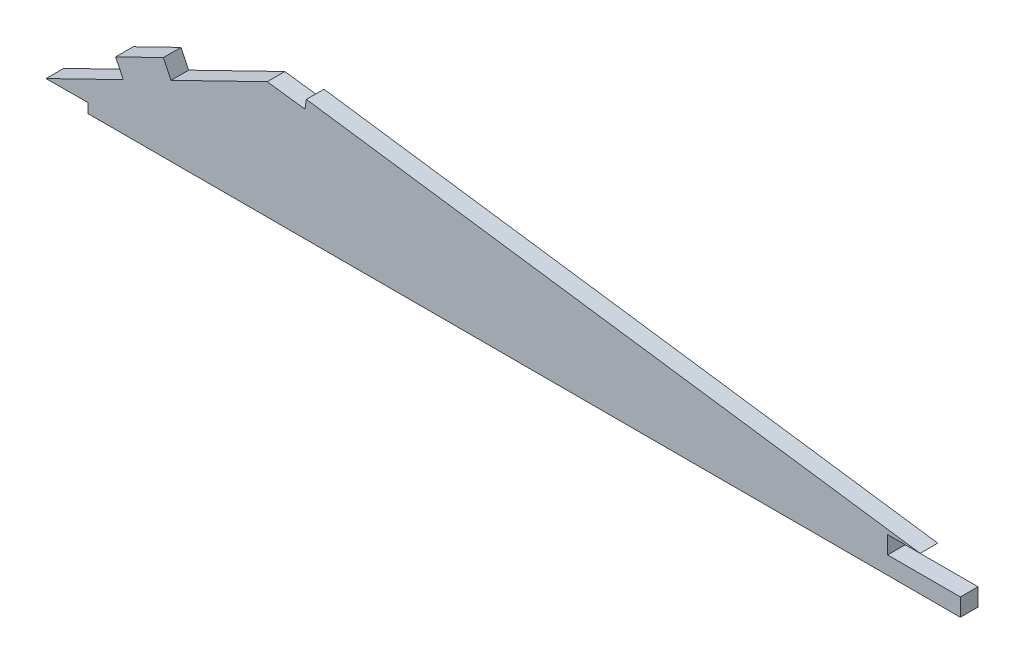
ISO-10303-21;
HEADER;
FILE_DESCRIPTION(('STEP AP214'),'2;1');
FILE_NAME('part.step','',(''),(''),'','','');
FILE_SCHEMA(('AUTOMOTIVE_DESIGN { 1 0 10303 214 1 1 1 1 }'));
ENDSEC;
DATA;
#1=APPLICATION_CONTEXT('core data for automotive mechanical design processes');
#2=APPLICATION_PROTOCOL_DEFINITION('international standard','automotive_design',2000,#1);
#3=PRODUCT_CONTEXT('',#1,'mechanical');
#4=PRODUCT('Part','Part','',(#3));
#5=PRODUCT_RELATED_PRODUCT_CATEGORY('part','',(#4));
#6=PRODUCT_DEFINITION_FORMATION('','',#4);
#7=PRODUCT_DEFINITION_CONTEXT('part definition',#1,'design');
#8=PRODUCT_DEFINITION('design','',#6,#7);
#9=PRODUCT_DEFINITION_SHAPE('','',#8);
#10=(LENGTH_UNIT() NAMED_UNIT(*) SI_UNIT(.MILLI.,.METRE.));
#11=(NAMED_UNIT(*) PLANE_ANGLE_UNIT() SI_UNIT($,.RADIAN.));
#12=(NAMED_UNIT(*) SI_UNIT($,.STERADIAN.) SOLID_ANGLE_UNIT());
#13=UNCERTAINTY_MEASURE_WITH_UNIT(LENGTH_MEASURE(1.E-05),#10,'distance_accuracy_value','');
#14=(GEOMETRIC_REPRESENTATION_CONTEXT(3) GLOBAL_UNCERTAINTY_ASSIGNED_CONTEXT((#13)) GLOBAL_UNIT_ASSIGNED_CONTEXT((#10,
#11,#12)) REPRESENTATION_CONTEXT('',''));
#15=CARTESIAN_POINT('',(0.,0.,0.));
#16=DIRECTION('',(0.,0.,1.));
#17=DIRECTION('',(1.,0.,0.));
#18=AXIS2_PLACEMENT_3D('',#15,#16,#17);
#19=CARTESIAN_POINT('',(15.844545114635,14.6199005087343,2.));
#20=DIRECTION('',(-0.898794046299282,-0.438371146788841,0.));
#21=DIRECTION('',(0.438371146788841,-0.898794046299282,0.));
#22=AXIS2_PLACEMENT_3D('',#19,#20,#21);
#23=PLANE('',#22);
#24=DIRECTION('',(-0.438371146788841,0.898794046299282,0.));
#25=VECTOR('',#24,1.);
#26=CARTESIAN_POINT('',(15.844545114635,14.6199005087343,0.));
#27=LINE('',#26,#25);
#28=CARTESIAN_POINT('',(16.721287408213,12.8223124161351,0.));
#29=VERTEX_POINT('',#28);
#30=CARTESIAN_POINT('',(15.844545114635,14.6199005087343,0.));
#31=VERTEX_POINT('',#30);
#32=EDGE_CURVE('E172',#29,#31,#27,.T.);
#33=ORIENTED_EDGE('',*,*,#32,.T.);
#34=DIRECTION('',(0.,0.,-1.));
#35=VECTOR('',#34,1.);
#36=CARTESIAN_POINT('',(15.844545114635,14.6199005087343,2.));
#37=LINE('',#36,#35);
#38=CARTESIAN_POINT('',(15.844545114635,14.6199005087343,2.));
#39=VERTEX_POINT('',#38);
#40=EDGE_CURVE('E11',#39,#31,#37,.T.);
#41=ORIENTED_EDGE('',*,*,#40,.F.);
#42=DIRECTION('',(-0.438371146788841,0.898794046299282,0.));
#43=VECTOR('',#42,1.);
#44=CARTESIAN_POINT('',(15.844545114635,14.6199005087343,2.));
#45=LINE('',#44,#43);
#46=CARTESIAN_POINT('',(16.721287408213,12.8223124161351,2.));
#47=VERTEX_POINT('',#46);
#48=EDGE_CURVE('E200',#47,#39,#45,.T.);
#49=ORIENTED_EDGE('',*,*,#48,.F.);
#50=DIRECTION('',(0.,0.,-1.));
#51=VECTOR('',#50,1.);
#52=CARTESIAN_POINT('',(16.721287408213,12.8223124161351,2.));
#53=LINE('',#52,#51);
#54=EDGE_CURVE('E168',#47,#29,#53,.T.);
#55=ORIENTED_EDGE('',*,*,#54,.T.);
#56=EDGE_LOOP('',(#33,#41,#49,#55));
#57=FACE_BOUND('',#56,.T.);
#58=ADVANCED_FACE('F34',(#57),#23,.F.);
#59=CARTESIAN_POINT('',(10.4258955683068,11.9770485389714,2.));
#60=DIRECTION('',(0.438371146789212,-0.898794046299101,0.));
#61=DIRECTION('',(0.898794046299101,0.438371146789212,0.));
#62=AXIS2_PLACEMENT_3D('',#59,#60,#61);
#63=PLANE('',#62);
#64=DIRECTION('',(-0.898794046299101,-0.438371146789212,0.));
#65=VECTOR('',#64,1.);
#66=CARTESIAN_POINT('',(10.4258955683068,11.9770485389714,0.));
#67=LINE('',#66,#65);
#68=CARTESIAN_POINT('',(10.4258955683068,11.9770485389714,0.));
#69=VERTEX_POINT('',#68);
#70=EDGE_CURVE('E175',#31,#69,#67,.T.);
#71=ORIENTED_EDGE('',*,*,#70,.T.);
#72=DIRECTION('',(0.,0.,-1.));
#73=VECTOR('',#72,1.);
#74=CARTESIAN_POINT('',(10.4258955683068,11.9770485389714,2.));
#75=LINE('',#74,#73);
#76=CARTESIAN_POINT('',(10.4258955683068,11.9770485389714,2.));
#77=VERTEX_POINT('',#76);
#78=EDGE_CURVE('E42',#77,#69,#75,.T.);
#79=ORIENTED_EDGE('',*,*,#78,.F.);
#80=DIRECTION('',(-0.898794046299101,-0.438371146789212,0.));
#81=VECTOR('',#80,1.);
#82=CARTESIAN_POINT('',(10.4258955683068,11.9770485389714,2.));
#83=LINE('',#82,#81);
#84=EDGE_CURVE('E114',#39,#77,#83,.T.);
#85=ORIENTED_EDGE('',*,*,#84,.F.);
#86=ORIENTED_EDGE('',*,*,#40,.T.);
#87=EDGE_LOOP('',(#71,#79,#85,#86));
#88=FACE_BOUND('',#87,.T.);
#89=ADVANCED_FACE('F293',(#88),#63,.F.);
#90=CARTESIAN_POINT('',(11.3026378618857,10.1794604463754,2.));
#91=DIRECTION('',(0.898794046298798,0.438371146789834,0.));
#92=DIRECTION('',(-0.438371146789834,0.898794046298798,0.));
#93=AXIS2_PLACEMENT_3D('',#90,#91,#92);
#94=PLANE('',#93);
#95=DIRECTION('',(0.438371146789834,-0.898794046298798,0.));
#96=VECTOR('',#95,1.);
#97=CARTESIAN_POINT('',(11.3026378618857,10.1794604463754,0.));
#98=LINE('',#97,#96);
#99=CARTESIAN_POINT('',(11.3026378618857,10.1794604463754,0.));
#100=VERTEX_POINT('',#99);
#101=EDGE_CURVE('E177',#69,#100,#98,.T.);
#102=ORIENTED_EDGE('',*,*,#101,.T.);
#103=DIRECTION('',(0.,0.,-1.));
#104=VECTOR('',#103,1.);
#105=CARTESIAN_POINT('',(11.3026378618857,10.1794604463754,2.));
#106=LINE('',#105,#104);
#107=CARTESIAN_POINT('',(11.3026378618857,10.1794604463754,2.));
#108=VERTEX_POINT('',#107);
#109=EDGE_CURVE('E228',#108,#100,#106,.T.);
#110=ORIENTED_EDGE('',*,*,#109,.F.);
#111=DIRECTION('',(0.438371146789834,-0.898794046298798,0.));
#112=VECTOR('',#111,1.);
#113=CARTESIAN_POINT('',(11.3026378618857,10.1794604463754,2.));
#114=LINE('',#113,#112);
#115=EDGE_CURVE('E236',#77,#108,#114,.T.);
#116=ORIENTED_EDGE('',*,*,#115,.F.);
#117=ORIENTED_EDGE('',*,*,#78,.T.);
#118=EDGE_LOOP('',(#102,#110,#116,#117));
#119=FACE_BOUND('',#118,.T.);
#120=ADVANCED_FACE('F234',(#119),#94,.F.);
#121=CARTESIAN_POINT('',(2.52896989953078,5.90025665987847,2.));
#122=DIRECTION('',(0.438371146789097,-0.898794046299158,0.));
#123=DIRECTION('',(0.898794046299158,0.438371146789097,0.));
#124=AXIS2_PLACEMENT_3D('',#121,#122,#123);
#125=PLANE('',#124);
#126=DIRECTION('',(-0.898794046299158,-0.438371146789097,0.));
#127=VECTOR('',#126,1.);
#128=CARTESIAN_POINT('',(2.52896989953078,5.90025665987847,0.));
#129=LINE('',#128,#127);
#130=CARTESIAN_POINT('',(2.52896989953078,5.90025665987847,0.));
#131=VERTEX_POINT('',#130);
#132=EDGE_CURVE('E179',#100,#131,#129,.T.);
#133=ORIENTED_EDGE('',*,*,#132,.T.);
#134=DIRECTION('',(0.,0.,-1.));
#135=VECTOR('',#134,1.);
#136=CARTESIAN_POINT('',(2.52896989953078,5.90025665987847,2.));
#137=LINE('',#136,#135);
#138=CARTESIAN_POINT('',(2.52896989953078,5.90025665987847,2.));
#139=VERTEX_POINT('',#138);
#140=EDGE_CURVE('E225',#139,#131,#137,.T.);
#141=ORIENTED_EDGE('',*,*,#140,.F.);
#142=DIRECTION('',(-0.898794046299158,-0.438371146789097,0.));
#143=VECTOR('',#142,1.);
#144=CARTESIAN_POINT('',(2.52896989953078,5.90025665987847,2.));
#145=LINE('',#144,#143);
#146=EDGE_CURVE('E254',#108,#139,#145,.T.);
#147=ORIENTED_EDGE('',*,*,#146,.F.);
#148=ORIENTED_EDGE('',*,*,#109,.T.);
#149=EDGE_LOOP('',(#133,#141,#147,#148));
#150=FACE_BOUND('',#149,.T.);
#151=ADVANCED_FACE('F245',(#150),#125,.F.);
#152=CARTESIAN_POINT('',(7.31043569777975,5.91881293104703,2.));
#153=DIRECTION('',(-0.00388084579359874,0.999992469489609,0.));
#154=DIRECTION('',(-0.999992469489609,-0.00388084579359874,0.));
#155=AXIS2_PLACEMENT_3D('',#152,#153,#154);
#156=PLANE('',#155);
#157=DIRECTION('',(0.999992469489609,0.00388084579359873,0.));
#158=VECTOR('',#157,1.);
#159=CARTESIAN_POINT('',(7.31043569777975,5.91881293104703,0.));
#160=LINE('',#159,#158);
#161=CARTESIAN_POINT('',(7.31043569777975,5.91881293104703,0.));
#162=VERTEX_POINT('',#161);
#163=EDGE_CURVE('E181',#131,#162,#160,.T.);
#164=ORIENTED_EDGE('',*,*,#163,.T.);
#165=DIRECTION('',(0.,0.,-1.));
#166=VECTOR('',#165,1.);
#167=CARTESIAN_POINT('',(7.31043569777975,5.91881293104703,2.));
#168=LINE('',#167,#166);
#169=CARTESIAN_POINT('',(7.31043569777975,5.91881293104703,2.));
#170=VERTEX_POINT('',#169);
#171=EDGE_CURVE('E222',#170,#162,#168,.T.);
#172=ORIENTED_EDGE('',*,*,#171,.F.);
#173=DIRECTION('',(0.999992469489609,0.00388084579359873,0.));
#174=VECTOR('',#173,1.);
#175=CARTESIAN_POINT('',(7.31043569777975,5.91881293104703,2.));
#176=LINE('',#175,#174);
#177=EDGE_CURVE('E251',#139,#170,#176,.T.);
#178=ORIENTED_EDGE('',*,*,#177,.F.);
#179=ORIENTED_EDGE('',*,*,#140,.T.);
#180=EDGE_LOOP('',(#164,#172,#178,#179));
#181=FACE_BOUND('',#180,.T.);
#182=ADVANCED_FACE('F249',(#181),#156,.F.);
#183=CARTESIAN_POINT('',(7.3146393222456,4.83564883822297,2.));
#184=DIRECTION('',(0.99999246948962,0.00388084579082327,0.));
#185=DIRECTION('',(-0.00388084579082327,0.99999246948962,0.));
#186=AXIS2_PLACEMENT_3D('',#183,#184,#185);
#187=PLANE('',#186);
#188=DIRECTION('',(0.00388084579082327,-0.99999246948962,0.));
#189=VECTOR('',#188,1.);
#190=CARTESIAN_POINT('',(7.3146393222456,4.83564883822297,0.));
#191=LINE('',#190,#189);
#192=CARTESIAN_POINT('',(7.3146393222456,4.83564883822297,0.));
#193=VERTEX_POINT('',#192);
#194=EDGE_CURVE('E183',#162,#193,#191,.T.);
#195=ORIENTED_EDGE('',*,*,#194,.T.);
#196=DIRECTION('',(0.,0.,-1.));
#197=VECTOR('',#196,1.);
#198=CARTESIAN_POINT('',(7.3146393222456,4.83564883822297,2.));
#199=LINE('',#198,#197);
#200=CARTESIAN_POINT('',(7.3146393222456,4.83564883822297,2.));
#201=VERTEX_POINT('',#200);
#202=EDGE_CURVE('E219',#201,#193,#199,.T.);
#203=ORIENTED_EDGE('',*,*,#202,.F.);
#204=DIRECTION('',(0.00388084579082327,-0.99999246948962,0.));
#205=VECTOR('',#204,1.);
#206=CARTESIAN_POINT('',(7.3146393222456,4.83564883822297,2.));
#207=LINE('',#206,#205);
#208=EDGE_CURVE('E253',#170,#201,#207,.T.);
#209=ORIENTED_EDGE('',*,*,#208,.F.);
#210=ORIENTED_EDGE('',*,*,#171,.T.);
#211=EDGE_LOOP('',(#195,#203,#209,#210));
#212=FACE_BOUND('',#211,.T.);
#213=ADVANCED_FACE('F306',(#212),#187,.F.);
#214=CARTESIAN_POINT('',(7.3146393222456,4.83564883822297,2.));
#215=DIRECTION('',(0.,1.,0.));
#216=DIRECTION('',(0.,0.,1.));
#217=AXIS2_PLACEMENT_3D('',#214,#215,#216);
#218=PLANE('',#217);
#219=DIRECTION('',(1.,0.,0.));
#220=VECTOR('',#219,1.);
#221=CARTESIAN_POINT('',(7.3146393222456,4.83564883822297,0.));
#222=LINE('',#221,#220);
#223=CARTESIAN_POINT('',(106.29161027576,4.83564883822297,0.));
#224=VERTEX_POINT('',#223);
#225=EDGE_CURVE('E185',#193,#224,#222,.T.);
#226=ORIENTED_EDGE('',*,*,#225,.T.);
#227=DIRECTION('',(0.,0.,-1.));
#228=VECTOR('',#227,1.);
#229=CARTESIAN_POINT('',(106.29161027576,4.83564883822297,2.));
#230=LINE('',#229,#228);
#231=CARTESIAN_POINT('',(106.29161027576,4.83564883822297,2.));
#232=VERTEX_POINT('',#231);
#233=EDGE_CURVE('E216',#232,#224,#230,.T.);
#234=ORIENTED_EDGE('',*,*,#233,.F.);
#235=DIRECTION('',(1.,0.,0.));
#236=VECTOR('',#235,1.);
#237=CARTESIAN_POINT('',(7.3146393222456,4.83564883822297,2.));
#238=LINE('',#237,#236);
#239=EDGE_CURVE('E256',#201,#232,#238,.T.);
#240=ORIENTED_EDGE('',*,*,#239,.F.);
#241=ORIENTED_EDGE('',*,*,#202,.T.);
#242=EDGE_LOOP('',(#226,#234,#240,#241));
#243=FACE_BOUND('',#242,.T.);
#244=ADVANCED_FACE('F309',(#243),#218,.F.);
#245=CARTESIAN_POINT('',(106.29161027576,4.83564883822297,2.));
#246=DIRECTION('',(-1.,0.,0.));
#247=DIRECTION('',(0.,0.,1.));
#248=AXIS2_PLACEMENT_3D('',#245,#246,#247);
#249=PLANE('',#248);
#250=DIRECTION('',(0.,1.,0.));
#251=VECTOR('',#250,1.);
#252=CARTESIAN_POINT('',(106.29161027576,4.83564883822297,0.));
#253=LINE('',#252,#251);
#254=CARTESIAN_POINT('',(106.29161027576,6.83564883822388,0.));
#255=VERTEX_POINT('',#254);
#256=EDGE_CURVE('E187',#224,#255,#253,.T.);
#257=ORIENTED_EDGE('',*,*,#256,.T.);
#258=DIRECTION('',(0.,0.,-1.));
#259=VECTOR('',#258,1.);
#260=CARTESIAN_POINT('',(106.29161027576,6.83564883822388,2.));
#261=LINE('',#260,#259);
#262=CARTESIAN_POINT('',(106.29161027576,6.83564883822388,2.));
#263=VERTEX_POINT('',#262);
#264=EDGE_CURVE('E213',#263,#255,#261,.T.);
#265=ORIENTED_EDGE('',*,*,#264,.F.);
#266=DIRECTION('',(0.,1.,0.));
#267=VECTOR('',#266,1.);
#268=CARTESIAN_POINT('',(106.29161027576,4.83564883822297,2.));
#269=LINE('',#268,#267);
#270=EDGE_CURVE('E262',#232,#263,#269,.T.);
#271=ORIENTED_EDGE('',*,*,#270,.F.);
#272=ORIENTED_EDGE('',*,*,#233,.T.);
#273=EDGE_LOOP('',(#257,#265,#271,#272));
#274=FACE_BOUND('',#273,.T.);
#275=ADVANCED_FACE('F313',(#274),#249,.F.);
#276=CARTESIAN_POINT('',(98.0354338797793,6.83564883822342,2.));
#277=DIRECTION('',(0.,-1.,0.));
#278=DIRECTION('',(1.,0.,0.));
#279=AXIS2_PLACEMENT_3D('',#276,#277,#278);
#280=PLANE('',#279);
#281=DIRECTION('',(-1.,0.,0.));
#282=VECTOR('',#281,1.);
#283=CARTESIAN_POINT('',(98.0354338797793,6.83564883822342,0.));
#284=LINE('',#283,#282);
#285=CARTESIAN_POINT('',(98.0354338797793,6.83564883822342,0.));
#286=VERTEX_POINT('',#285);
#287=EDGE_CURVE('E189',#255,#286,#284,.T.);
#288=ORIENTED_EDGE('',*,*,#287,.T.);
#289=DIRECTION('',(0.,0.,-1.));
#290=VECTOR('',#289,1.);
#291=CARTESIAN_POINT('',(98.0354338797793,6.83564883822342,2.));
#292=LINE('',#291,#290);
#293=CARTESIAN_POINT('',(98.0354338797793,6.83564883822342,2.));
#294=VERTEX_POINT('',#293);
#295=EDGE_CURVE('E210',#294,#286,#292,.T.);
#296=ORIENTED_EDGE('',*,*,#295,.F.);
#297=DIRECTION('',(-1.,0.,0.));
#298=VECTOR('',#297,1.);
#299=CARTESIAN_POINT('',(98.0354338797793,6.83564883822342,2.));
#300=LINE('',#299,#298);
#301=EDGE_CURVE('E264',#263,#294,#300,.T.);
#302=ORIENTED_EDGE('',*,*,#301,.F.);
#303=ORIENTED_EDGE('',*,*,#264,.T.);
#304=EDGE_LOOP('',(#288,#296,#302,#303));
#305=FACE_BOUND('',#304,.T.);
#306=ADVANCED_FACE('F317',(#305),#280,.F.);
#307=CARTESIAN_POINT('',(98.0354338797793,6.83564883822342,2.));
#308=DIRECTION('',(-1.,-4.57966997657773E-13,0.));
#309=DIRECTION('',(4.57966997657773E-13,-1.,0.));
#310=AXIS2_PLACEMENT_3D('',#307,#308,#309);
#311=PLANE('',#310);
#312=DIRECTION('',(-4.57966997657773E-13,1.,0.));
#313=VECTOR('',#312,1.);
#314=CARTESIAN_POINT('',(98.0354338797793,6.83564883822342,0.));
#315=LINE('',#314,#313);
#316=CARTESIAN_POINT('',(98.0354338797784,8.83564883822388,0.));
#317=VERTEX_POINT('',#316);
#318=EDGE_CURVE('E191',#286,#317,#315,.T.);
#319=ORIENTED_EDGE('',*,*,#318,.T.);
#320=DIRECTION('',(0.,0.,-1.));
#321=VECTOR('',#320,1.);
#322=CARTESIAN_POINT('',(98.0354338797784,8.83564883822388,2.));
#323=LINE('',#322,#321);
#324=CARTESIAN_POINT('',(98.0354338797784,8.83564883822388,2.));
#325=VERTEX_POINT('',#324);
#326=EDGE_CURVE('E207',#325,#317,#323,.T.);
#327=ORIENTED_EDGE('',*,*,#326,.F.);
#328=DIRECTION('',(-4.57966997657773E-13,1.,0.));
#329=VECTOR('',#328,1.);
#330=CARTESIAN_POINT('',(98.0354338797793,6.83564883822342,2.));
#331=LINE('',#330,#329);
#332=EDGE_CURVE('E266',#294,#325,#331,.T.);
#333=ORIENTED_EDGE('',*,*,#332,.F.);
#334=ORIENTED_EDGE('',*,*,#295,.T.);
#335=EDGE_LOOP('',(#319,#327,#333,#334));
#336=FACE_BOUND('',#335,.T.);
#337=ADVANCED_FACE('F321',(#336),#311,.F.);
#338=CARTESIAN_POINT('',(98.0354338797784,8.83564883822388,2.));
#339=DIRECTION('',(-2.46511092201905E-13,1.,0.));
#340=DIRECTION('',(-1.,-2.46511092201905E-13,0.));
#341=AXIS2_PLACEMENT_3D('',#338,#339,#340);
#342=PLANE('',#341);
#343=DIRECTION('',(1.,2.46511092201905E-13,0.));
#344=VECTOR('',#343,1.);
#345=CARTESIAN_POINT('',(98.0354338797784,8.83564883822388,0.));
#346=LINE('',#345,#344);
#347=CARTESIAN_POINT('',(101.722874851673,8.83564883822478,0.));
#348=VERTEX_POINT('',#347);
#349=EDGE_CURVE('E193',#317,#348,#346,.T.);
#350=ORIENTED_EDGE('',*,*,#349,.T.);
#351=DIRECTION('',(0.,0.,-1.));
#352=VECTOR('',#351,1.);
#353=CARTESIAN_POINT('',(101.722874851673,8.83564883822478,2.));
#354=LINE('',#353,#352);
#355=CARTESIAN_POINT('',(101.722874851673,8.83564883822478,2.));
#356=VERTEX_POINT('',#355);
#357=EDGE_CURVE('E204',#356,#348,#354,.T.);
#358=ORIENTED_EDGE('',*,*,#357,.F.);
#359=DIRECTION('',(1.,2.46511092201905E-13,0.));
#360=VECTOR('',#359,1.);
#361=CARTESIAN_POINT('',(98.0354338797784,8.83564883822388,2.));
#362=LINE('',#361,#360);
#363=EDGE_CURVE('E268',#325,#356,#362,.T.);
#364=ORIENTED_EDGE('',*,*,#363,.F.);
#365=ORIENTED_EDGE('',*,*,#326,.T.);
#366=EDGE_LOOP('',(#350,#358,#364,#365));
#367=FACE_BOUND('',#366,.T.);
#368=ADVANCED_FACE('F274',(#367),#342,.F.);
#369=CARTESIAN_POINT('',(32.0713085036737,18.6245381111018,2.));
#370=DIRECTION('',(-0.139173100960067,-0.99026806874157,0.));
#371=DIRECTION('',(0.99026806874157,-0.139173100960067,0.));
#372=AXIS2_PLACEMENT_3D('',#369,#370,#371);
#373=PLANE('',#372);
#374=DIRECTION('',(-0.99026806874157,0.139173100960067,0.));
#375=VECTOR('',#374,1.);
#376=CARTESIAN_POINT('',(32.0713085036737,18.6245381111018,0.));
#377=LINE('',#376,#375);
#378=CARTESIAN_POINT('',(32.0713085036737,18.6245381111018,0.));
#379=VERTEX_POINT('',#378);
#380=EDGE_CURVE('E195',#348,#379,#377,.T.);
#381=ORIENTED_EDGE('',*,*,#380,.T.);
#382=DIRECTION('',(0.,0.,-1.));
#383=VECTOR('',#382,1.);
#384=CARTESIAN_POINT('',(32.0713085036737,18.6245381111018,2.));
#385=LINE('',#384,#383);
#386=CARTESIAN_POINT('',(32.0713085036737,18.6245381111018,2.));
#387=VERTEX_POINT('',#386);
#388=EDGE_CURVE('E163',#387,#379,#385,.T.);
#389=ORIENTED_EDGE('',*,*,#388,.F.);
#390=DIRECTION('',(-0.99026806874157,0.139173100960067,0.));
#391=VECTOR('',#390,1.);
#392=CARTESIAN_POINT('',(32.0713085036737,18.6245381111018,2.));
#393=LINE('',#392,#391);
#394=EDGE_CURVE('E154',#356,#387,#393,.T.);
#395=ORIENTED_EDGE('',*,*,#394,.F.);
#396=ORIENTED_EDGE('',*,*,#357,.T.);
#397=EDGE_LOOP('',(#381,#389,#395,#396));
#398=FACE_BOUND('',#397,.T.);
#399=ADVANCED_FACE('F278',(#398),#373,.F.);
#400=CARTESIAN_POINT('',(31.9230984508827,17.5868458536476,2.));
#401=DIRECTION('',(0.989953726819002,-0.141391720964029,0.));
#402=DIRECTION('',(0.141391720964029,0.989953726819002,0.));
#403=AXIS2_PLACEMENT_3D('',#400,#401,#402);
#404=PLANE('',#403);
#405=DIRECTION('',(-0.141391720964029,-0.989953726819001,0.));
#406=VECTOR('',#405,1.);
#407=CARTESIAN_POINT('',(31.9230984508827,17.5868458536476,0.));
#408=LINE('',#407,#406);
#409=CARTESIAN_POINT('',(31.9230984508827,17.5868458536476,0.));
#410=VERTEX_POINT('',#409);
#411=EDGE_CURVE('E162',#379,#410,#408,.T.);
#412=ORIENTED_EDGE('',*,*,#411,.T.);
#413=DIRECTION('',(0.,0.,-1.));
#414=VECTOR('',#413,1.);
#415=CARTESIAN_POINT('',(31.9230984508827,17.5868458536476,2.));
#416=LINE('',#415,#414);
#417=CARTESIAN_POINT('',(31.9230984508827,17.5868458536476,2.));
#418=VERTEX_POINT('',#417);
#419=EDGE_CURVE('E159',#418,#410,#416,.T.);
#420=ORIENTED_EDGE('',*,*,#419,.F.);
#421=DIRECTION('',(-0.141391720964029,-0.989953726819001,0.));
#422=VECTOR('',#421,1.);
#423=CARTESIAN_POINT('',(31.9230984508827,17.5868458536476,2.));
#424=LINE('',#423,#422);
#425=EDGE_CURVE('E148',#387,#418,#424,.T.);
#426=ORIENTED_EDGE('',*,*,#425,.F.);
#427=ORIENTED_EDGE('',*,*,#388,.T.);
#428=EDGE_LOOP('',(#412,#420,#426,#427));
#429=FACE_BOUND('',#428,.T.);
#430=ADVANCED_FACE('F160',(#429),#404,.F.);
#431=CARTESIAN_POINT('',(27.6288728275127,18.1422972876932,2.));
#432=DIRECTION('',(-0.128279776915875,-0.991738019254286,0.));
#433=DIRECTION('',(0.991738019254286,-0.128279776915875,0.));
#434=AXIS2_PLACEMENT_3D('',#431,#432,#433);
#435=PLANE('',#434);
#436=DIRECTION('',(-0.991738019254285,0.128279776915875,0.));
#437=VECTOR('',#436,1.);
#438=CARTESIAN_POINT('',(27.6288728275127,18.1422972876932,0.));
#439=LINE('',#438,#437);
#440=CARTESIAN_POINT('',(27.6288728275127,18.1422972876932,0.));
#441=VERTEX_POINT('',#440);
#442=EDGE_CURVE('E100',#410,#441,#439,.T.);
#443=ORIENTED_EDGE('',*,*,#442,.T.);
#444=DIRECTION('',(0.,0.,-1.));
#445=VECTOR('',#444,1.);
#446=CARTESIAN_POINT('',(27.6288728275127,18.1422972876932,2.));
#447=LINE('',#446,#445);
#448=CARTESIAN_POINT('',(27.6288728275127,18.1422972876932,2.));
#449=VERTEX_POINT('',#448);
#450=EDGE_CURVE('E164',#449,#441,#447,.T.);
#451=ORIENTED_EDGE('',*,*,#450,.F.);
#452=DIRECTION('',(-0.991738019254285,0.128279776915875,0.));
#453=VECTOR('',#452,1.);
#454=CARTESIAN_POINT('',(27.6288728275127,18.1422972876932,2.));
#455=LINE('',#454,#453);
#456=EDGE_CURVE('E152',#418,#449,#455,.T.);
#457=ORIENTED_EDGE('',*,*,#456,.F.);
#458=ORIENTED_EDGE('',*,*,#419,.T.);
#459=EDGE_LOOP('',(#443,#451,#457,#458));
#460=FACE_BOUND('',#459,.T.);
#461=ADVANCED_FACE('F166',(#460),#435,.F.);
#462=CARTESIAN_POINT('',(16.721287408213,12.8223124161351,2.));
#463=DIRECTION('',(0.438371146789062,-0.898794046299175,0.));
#464=DIRECTION('',(0.898794046299175,0.438371146789062,0.));
#465=AXIS2_PLACEMENT_3D('',#462,#463,#464);
#466=PLANE('',#465);
#467=DIRECTION('',(-0.898794046299175,-0.438371146789062,0.));
#468=VECTOR('',#467,1.);
#469=CARTESIAN_POINT('',(16.721287408213,12.8223124161351,0.));
#470=LINE('',#469,#468);
#471=EDGE_CURVE('E106',#441,#29,#470,.T.);
#472=ORIENTED_EDGE('',*,*,#471,.T.);
#473=ORIENTED_EDGE('',*,*,#54,.F.);
#474=DIRECTION('',(-0.898794046299175,-0.438371146789062,0.));
#475=VECTOR('',#474,1.);
#476=CARTESIAN_POINT('',(16.721287408213,12.8223124161351,2.));
#477=LINE('',#476,#475);
#478=EDGE_CURVE('E50',#449,#47,#477,.T.);
#479=ORIENTED_EDGE('',*,*,#478,.F.);
#480=ORIENTED_EDGE('',*,*,#450,.T.);
#481=EDGE_LOOP('',(#472,#473,#479,#480));
#482=FACE_BOUND('',#481,.T.);
#483=ADVANCED_FACE('F282',(#482),#466,.F.);
#484=CARTESIAN_POINT('',(0.,0.,2.));
#485=DIRECTION('',(0.,0.,1.));
#486=DIRECTION('',(1.,0.,0.));
#487=AXIS2_PLACEMENT_3D('',#484,#485,#486);
#488=PLANE('',#487);
#489=ORIENTED_EDGE('',*,*,#48,.T.);
#490=ORIENTED_EDGE('',*,*,#84,.T.);
#491=ORIENTED_EDGE('',*,*,#115,.T.);
#492=ORIENTED_EDGE('',*,*,#146,.T.);
#493=ORIENTED_EDGE('',*,*,#177,.T.);
#494=ORIENTED_EDGE('',*,*,#208,.T.);
#495=ORIENTED_EDGE('',*,*,#239,.T.);
#496=ORIENTED_EDGE('',*,*,#270,.T.);
#497=ORIENTED_EDGE('',*,*,#301,.T.);
#498=ORIENTED_EDGE('',*,*,#332,.T.);
#499=ORIENTED_EDGE('',*,*,#363,.T.);
#500=ORIENTED_EDGE('',*,*,#394,.T.);
#501=ORIENTED_EDGE('',*,*,#425,.T.);
#502=ORIENTED_EDGE('',*,*,#456,.T.);
#503=ORIENTED_EDGE('',*,*,#478,.T.);
#504=EDGE_LOOP('',(#489,#490,#491,#492,#493,#494,#495,#496,#497,#498,#499,#500,#501,#502,#503));
#505=FACE_BOUND('',#504,.T.);
#506=ADVANCED_FACE('F150',(#505),#488,.T.);
#507=CARTESIAN_POINT('',(0.,0.,0.));
#508=DIRECTION('',(0.,0.,1.));
#509=DIRECTION('',(1.,0.,0.));
#510=AXIS2_PLACEMENT_3D('',#507,#508,#509);
#511=PLANE('',#510);
#512=ORIENTED_EDGE('',*,*,#32,.F.);
#513=ORIENTED_EDGE('',*,*,#471,.F.);
#514=ORIENTED_EDGE('',*,*,#442,.F.);
#515=ORIENTED_EDGE('',*,*,#411,.F.);
#516=ORIENTED_EDGE('',*,*,#380,.F.);
#517=ORIENTED_EDGE('',*,*,#349,.F.);
#518=ORIENTED_EDGE('',*,*,#318,.F.);
#519=ORIENTED_EDGE('',*,*,#287,.F.);
#520=ORIENTED_EDGE('',*,*,#256,.F.);
#521=ORIENTED_EDGE('',*,*,#225,.F.);
#522=ORIENTED_EDGE('',*,*,#194,.F.);
#523=ORIENTED_EDGE('',*,*,#163,.F.);
#524=ORIENTED_EDGE('',*,*,#132,.F.);
#525=ORIENTED_EDGE('',*,*,#101,.F.);
#526=ORIENTED_EDGE('',*,*,#70,.F.);
#527=EDGE_LOOP('',(#512,#513,#514,#515,#516,#517,#518,#519,#520,#521,#522,#523,#524,#525,#526));
#528=FACE_BOUND('',#527,.T.);
#529=ADVANCED_FACE('F240',(#528),#511,.F.);
#530=CLOSED_SHELL('',(#58,#89,#120,#151,#182,#213,#244,#275,#306,#337,#368,#399,#430,#461,#483,
#506,#529));
#531=MANIFOLD_SOLID_BREP('B2',#530);
#532=ADVANCED_BREP_SHAPE_REPRESENTATION('',(#18,#531),#14);
#533=SHAPE_DEFINITION_REPRESENTATION(#9,#532);
ENDSEC;
END-ISO-10303-21;
